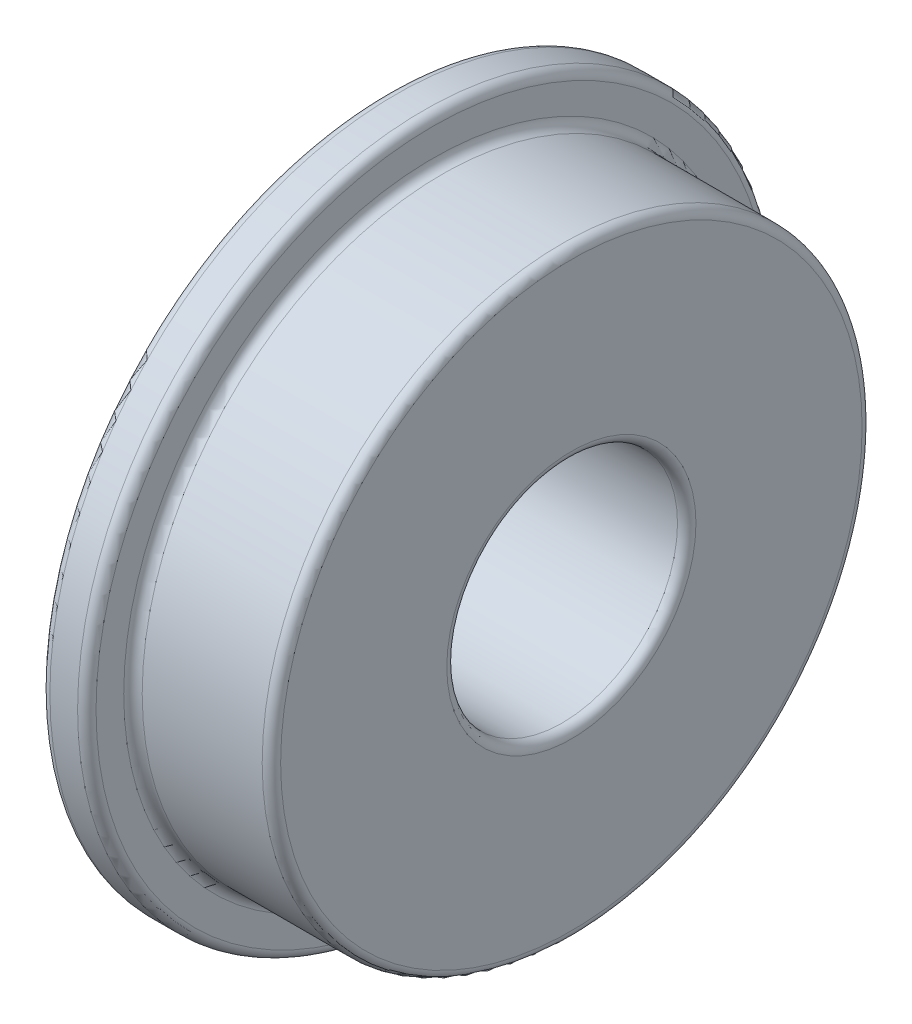
ISO-10303-21;
HEADER;
FILE_DESCRIPTION(('STEP AP214'),'2;1');
FILE_NAME('part.step','',(''),(''),'','','');
FILE_SCHEMA(('AUTOMOTIVE_DESIGN { 1 0 10303 214 1 1 1 1 }'));
ENDSEC;
DATA;
#1=APPLICATION_CONTEXT('core data for automotive mechanical design processes');
#2=APPLICATION_PROTOCOL_DEFINITION('international standard','automotive_design',2000,#1);
#3=PRODUCT_CONTEXT('',#1,'mechanical');
#4=PRODUCT('Part','Part','',(#3));
#5=PRODUCT_RELATED_PRODUCT_CATEGORY('part','',(#4));
#6=PRODUCT_DEFINITION_FORMATION('','',#4);
#7=PRODUCT_DEFINITION_CONTEXT('part definition',#1,'design');
#8=PRODUCT_DEFINITION('design','',#6,#7);
#9=PRODUCT_DEFINITION_SHAPE('','',#8);
#10=(LENGTH_UNIT() NAMED_UNIT(*) SI_UNIT(.MILLI.,.METRE.));
#11=(NAMED_UNIT(*) PLANE_ANGLE_UNIT() SI_UNIT($,.RADIAN.));
#12=(NAMED_UNIT(*) SI_UNIT($,.STERADIAN.) SOLID_ANGLE_UNIT());
#13=UNCERTAINTY_MEASURE_WITH_UNIT(LENGTH_MEASURE(1.E-05),#10,'distance_accuracy_value','');
#14=(GEOMETRIC_REPRESENTATION_CONTEXT(3) GLOBAL_UNCERTAINTY_ASSIGNED_CONTEXT((#13)) GLOBAL_UNIT_ASSIGNED_CONTEXT((#10,
#11,#12)) REPRESENTATION_CONTEXT('',''));
#15=CARTESIAN_POINT('',(0.,0.,0.));
#16=DIRECTION('',(0.,0.,1.));
#17=DIRECTION('',(1.,0.,0.));
#18=AXIS2_PLACEMENT_3D('',#15,#16,#17);
#19=CARTESIAN_POINT('',(0.,7.5,0.));
#20=DIRECTION('',(1.,0.,0.));
#21=DIRECTION('',(0.,0.,-1.));
#22=AXIS2_PLACEMENT_3D('',#19,#20,#21);
#23=PLANE('',#22);
#24=CARTESIAN_POINT('',(0.,0.,0.));
#25=DIRECTION('',(1.,0.,0.));
#26=DIRECTION('',(0.,0.,-1.));
#27=AXIS2_PLACEMENT_3D('',#24,#25,#26);
#28=CIRCLE('',#27,7.3);
#29=CARTESIAN_POINT('',(0.,0.,-7.3));
#30=VERTEX_POINT('',#29);
#31=EDGE_CURVE('E71',#30,#30,#28,.F.);
#32=ORIENTED_EDGE('',*,*,#31,.T.);
#33=EDGE_LOOP('',(#32));
#34=FACE_BOUND('',#33,.T.);
#35=CARTESIAN_POINT('',(0.,0.,0.));
#36=DIRECTION('',(1.,0.,0.));
#37=DIRECTION('',(0.,0.,-1.));
#38=AXIS2_PLACEMENT_3D('',#35,#36,#37);
#39=CIRCLE('',#38,2.7);
#40=CARTESIAN_POINT('',(0.,0.,-2.7));
#41=VERTEX_POINT('',#40);
#42=EDGE_CURVE('E74',#41,#41,#39,.T.);
#43=ORIENTED_EDGE('',*,*,#42,.T.);
#44=EDGE_LOOP('',(#43));
#45=FACE_BOUND('',#44,.T.);
#46=ADVANCED_FACE('F33',(#34,#45),#23,.F.);
#47=CARTESIAN_POINT('',(0.,0.,0.));
#48=DIRECTION('',(-1.,0.,0.));
#49=DIRECTION('',(0.,0.,1.));
#50=AXIS2_PLACEMENT_3D('',#47,#48,#49);
#51=CYLINDRICAL_SURFACE('',#50,2.5);
#52=CARTESIAN_POINT('',(0.200000000000001,0.,0.));
#53=DIRECTION('',(1.,0.,0.));
#54=DIRECTION('',(0.,0.,-1.));
#55=AXIS2_PLACEMENT_3D('',#52,#53,#54);
#56=CIRCLE('',#55,2.5);
#57=CARTESIAN_POINT('',(0.200000000000001,0.,-2.5));
#58=VERTEX_POINT('',#57);
#59=EDGE_CURVE('E59',#58,#58,#56,.F.);
#60=ORIENTED_EDGE('',*,*,#59,.T.);
#61=EDGE_LOOP('',(#60));
#62=FACE_BOUND('',#61,.T.);
#63=CARTESIAN_POINT('',(3.8,0.,0.));
#64=DIRECTION('',(-1.,0.,0.));
#65=DIRECTION('',(0.,0.,1.));
#66=AXIS2_PLACEMENT_3D('',#63,#64,#65);
#67=CIRCLE('',#66,2.5);
#68=CARTESIAN_POINT('',(3.8,0.,2.5));
#69=VERTEX_POINT('',#68);
#70=EDGE_CURVE('E62',#69,#69,#67,.F.);
#71=ORIENTED_EDGE('',*,*,#70,.T.);
#72=EDGE_LOOP('',(#71));
#73=FACE_BOUND('',#72,.T.);
#74=ADVANCED_FACE('F87',(#62,#73),#51,.F.);
#75=CARTESIAN_POINT('',(4.,2.5,0.));
#76=DIRECTION('',(-1.,0.,0.));
#77=DIRECTION('',(0.,0.,1.));
#78=AXIS2_PLACEMENT_3D('',#75,#76,#77);
#79=PLANE('',#78);
#80=CARTESIAN_POINT('',(4.,0.,0.));
#81=DIRECTION('',(-1.,0.,0.));
#82=DIRECTION('',(0.,0.,1.));
#83=AXIS2_PLACEMENT_3D('',#80,#81,#82);
#84=CIRCLE('',#83,2.7);
#85=CARTESIAN_POINT('',(4.,0.,2.7));
#86=VERTEX_POINT('',#85);
#87=EDGE_CURVE('E53',#86,#86,#84,.T.);
#88=ORIENTED_EDGE('',*,*,#87,.T.);
#89=EDGE_LOOP('',(#88));
#90=FACE_BOUND('',#89,.T.);
#91=CARTESIAN_POINT('',(4.,0.,0.));
#92=DIRECTION('',(-1.,0.,0.));
#93=DIRECTION('',(0.,0.,1.));
#94=AXIS2_PLACEMENT_3D('',#91,#92,#93);
#95=CIRCLE('',#94,6.3);
#96=CARTESIAN_POINT('',(4.,0.,6.3));
#97=VERTEX_POINT('',#96);
#98=EDGE_CURVE('E56',#97,#97,#95,.F.);
#99=ORIENTED_EDGE('',*,*,#98,.T.);
#100=EDGE_LOOP('',(#99));
#101=FACE_BOUND('',#100,.T.);
#102=ADVANCED_FACE('F90',(#90,#101),#79,.F.);
#103=CARTESIAN_POINT('',(0.,0.,0.));
#104=DIRECTION('',(-1.,0.,0.));
#105=DIRECTION('',(0.,0.,1.));
#106=AXIS2_PLACEMENT_3D('',#103,#104,#105);
#107=CYLINDRICAL_SURFACE('',#106,6.5);
#108=CARTESIAN_POINT('',(1.2,0.,0.));
#109=DIRECTION('',(-1.,0.,0.));
#110=DIRECTION('',(0.,0.,1.));
#111=AXIS2_PLACEMENT_3D('',#108,#109,#110);
#112=CIRCLE('',#111,6.5);
#113=CARTESIAN_POINT('',(1.2,0.,6.5));
#114=VERTEX_POINT('',#113);
#115=EDGE_CURVE('E10',#114,#114,#112,.F.);
#116=ORIENTED_EDGE('',*,*,#115,.T.);
#117=EDGE_LOOP('',(#116));
#118=FACE_BOUND('',#117,.T.);
#119=CARTESIAN_POINT('',(3.8,0.,0.));
#120=DIRECTION('',(-1.,0.,0.));
#121=DIRECTION('',(0.,0.,1.));
#122=AXIS2_PLACEMENT_3D('',#119,#120,#121);
#123=CIRCLE('',#122,6.5);
#124=CARTESIAN_POINT('',(3.8,0.,6.5));
#125=VERTEX_POINT('',#124);
#126=EDGE_CURVE('E40',#125,#125,#123,.T.);
#127=ORIENTED_EDGE('',*,*,#126,.T.);
#128=EDGE_LOOP('',(#127));
#129=FACE_BOUND('',#128,.T.);
#130=ADVANCED_FACE('F102',(#118,#129),#107,.T.);
#131=CARTESIAN_POINT('',(1.,6.5,0.));
#132=DIRECTION('',(-1.,0.,0.));
#133=DIRECTION('',(0.,0.,1.));
#134=AXIS2_PLACEMENT_3D('',#131,#132,#133);
#135=PLANE('',#134);
#136=CARTESIAN_POINT('',(1.,0.,0.));
#137=DIRECTION('',(-1.,0.,0.));
#138=DIRECTION('',(0.,0.,1.));
#139=AXIS2_PLACEMENT_3D('',#136,#137,#138);
#140=CIRCLE('',#139,6.7);
#141=CARTESIAN_POINT('',(1.,0.,6.7));
#142=VERTEX_POINT('',#141);
#143=EDGE_CURVE('E44',#142,#142,#140,.T.);
#144=ORIENTED_EDGE('',*,*,#143,.T.);
#145=EDGE_LOOP('',(#144));
#146=FACE_BOUND('',#145,.T.);
#147=CARTESIAN_POINT('',(1.,0.,0.));
#148=DIRECTION('',(-1.,0.,0.));
#149=DIRECTION('',(0.,0.,1.));
#150=AXIS2_PLACEMENT_3D('',#147,#148,#149);
#151=CIRCLE('',#150,7.3);
#152=CARTESIAN_POINT('',(1.,0.,7.3));
#153=VERTEX_POINT('',#152);
#154=EDGE_CURVE('E48',#153,#153,#151,.F.);
#155=ORIENTED_EDGE('',*,*,#154,.T.);
#156=EDGE_LOOP('',(#155));
#157=FACE_BOUND('',#156,.T.);
#158=ADVANCED_FACE('F129',(#146,#157),#135,.F.);
#159=CARTESIAN_POINT('',(0.,0.,0.));
#160=DIRECTION('',(-1.,0.,0.));
#161=DIRECTION('',(0.,0.,1.));
#162=AXIS2_PLACEMENT_3D('',#159,#160,#161);
#163=CYLINDRICAL_SURFACE('',#162,7.5);
#164=CARTESIAN_POINT('',(0.200000000000001,0.,0.));
#165=DIRECTION('',(1.,0.,0.));
#166=DIRECTION('',(0.,0.,-1.));
#167=AXIS2_PLACEMENT_3D('',#164,#165,#166);
#168=CIRCLE('',#167,7.5);
#169=CARTESIAN_POINT('',(0.200000000000001,0.,-7.5));
#170=VERTEX_POINT('',#169);
#171=EDGE_CURVE('E65',#170,#170,#168,.T.);
#172=ORIENTED_EDGE('',*,*,#171,.T.);
#173=EDGE_LOOP('',(#172));
#174=FACE_BOUND('',#173,.T.);
#175=CARTESIAN_POINT('',(0.8,0.,0.));
#176=DIRECTION('',(-1.,0.,0.));
#177=DIRECTION('',(0.,0.,1.));
#178=AXIS2_PLACEMENT_3D('',#175,#176,#177);
#179=CIRCLE('',#178,7.5);
#180=CARTESIAN_POINT('',(0.8,0.,7.5));
#181=VERTEX_POINT('',#180);
#182=EDGE_CURVE('E68',#181,#181,#179,.T.);
#183=ORIENTED_EDGE('',*,*,#182,.T.);
#184=EDGE_LOOP('',(#183));
#185=FACE_BOUND('',#184,.T.);
#186=ADVANCED_FACE('F123',(#174,#185),#163,.T.);
#187=CARTESIAN_POINT('',(0.200000000000001,0.,0.));
#188=DIRECTION('',(1.,0.,0.));
#189=DIRECTION('',(0.,0.,-1.));
#190=AXIS2_PLACEMENT_3D('',#187,#188,#189);
#191=TOROIDAL_SURFACE('',#190,7.3,0.2);
#192=ORIENTED_EDGE('',*,*,#171,.F.);
#193=EDGE_LOOP('',(#192));
#194=FACE_BOUND('',#193,.T.);
#195=ORIENTED_EDGE('',*,*,#31,.F.);
#196=EDGE_LOOP('',(#195));
#197=FACE_BOUND('',#196,.T.);
#198=ADVANCED_FACE('F83',(#194,#197),#191,.T.);
#199=CARTESIAN_POINT('',(0.200000000000001,0.,0.));
#200=DIRECTION('',(1.,0.,0.));
#201=DIRECTION('',(0.,0.,-1.));
#202=AXIS2_PLACEMENT_3D('',#199,#200,#201);
#203=TOROIDAL_SURFACE('',#202,2.7,0.2);
#204=ORIENTED_EDGE('',*,*,#42,.F.);
#205=EDGE_LOOP('',(#204));
#206=FACE_BOUND('',#205,.T.);
#207=ORIENTED_EDGE('',*,*,#59,.F.);
#208=EDGE_LOOP('',(#207));
#209=FACE_BOUND('',#208,.T.);
#210=ADVANCED_FACE('F79',(#206,#209),#203,.T.);
#211=CARTESIAN_POINT('',(3.8,0.,0.));
#212=DIRECTION('',(-1.,0.,0.));
#213=DIRECTION('',(0.,0.,1.));
#214=AXIS2_PLACEMENT_3D('',#211,#212,#213);
#215=TOROIDAL_SURFACE('',#214,2.7,0.2);
#216=ORIENTED_EDGE('',*,*,#70,.F.);
#217=EDGE_LOOP('',(#216));
#218=FACE_BOUND('',#217,.T.);
#219=ORIENTED_EDGE('',*,*,#87,.F.);
#220=EDGE_LOOP('',(#219));
#221=FACE_BOUND('',#220,.T.);
#222=ADVANCED_FACE('F82',(#218,#221),#215,.T.);
#223=CARTESIAN_POINT('',(1.2,0.,0.));
#224=DIRECTION('',(-1.,0.,0.));
#225=DIRECTION('',(0.,0.,1.));
#226=AXIS2_PLACEMENT_3D('',#223,#224,#225);
#227=TOROIDAL_SURFACE('',#226,6.7,0.2);
#228=ORIENTED_EDGE('',*,*,#115,.F.);
#229=EDGE_LOOP('',(#228));
#230=FACE_BOUND('',#229,.T.);
#231=ORIENTED_EDGE('',*,*,#143,.F.);
#232=EDGE_LOOP('',(#231));
#233=FACE_BOUND('',#232,.T.);
#234=ADVANCED_FACE('F96',(#230,#233),#227,.F.);
#235=CARTESIAN_POINT('',(3.8,0.,0.));
#236=DIRECTION('',(-1.,0.,0.));
#237=DIRECTION('',(0.,0.,1.));
#238=AXIS2_PLACEMENT_3D('',#235,#236,#237);
#239=TOROIDAL_SURFACE('',#238,6.3,0.2);
#240=ORIENTED_EDGE('',*,*,#98,.F.);
#241=EDGE_LOOP('',(#240));
#242=FACE_BOUND('',#241,.T.);
#243=ORIENTED_EDGE('',*,*,#126,.F.);
#244=EDGE_LOOP('',(#243));
#245=FACE_BOUND('',#244,.T.);
#246=ADVANCED_FACE('F106',(#242,#245),#239,.T.);
#247=CARTESIAN_POINT('',(0.8,0.,0.));
#248=DIRECTION('',(-1.,0.,0.));
#249=DIRECTION('',(0.,0.,1.));
#250=AXIS2_PLACEMENT_3D('',#247,#248,#249);
#251=TOROIDAL_SURFACE('',#250,7.3,0.2);
#252=ORIENTED_EDGE('',*,*,#154,.F.);
#253=EDGE_LOOP('',(#252));
#254=FACE_BOUND('',#253,.T.);
#255=ORIENTED_EDGE('',*,*,#182,.F.);
#256=EDGE_LOOP('',(#255));
#257=FACE_BOUND('',#256,.T.);
#258=ADVANCED_FACE('F35',(#254,#257),#251,.T.);
#259=CLOSED_SHELL('',(#46,#74,#102,#130,#158,#186,#198,#210,#222,#234,#246,#258));
#260=MANIFOLD_SOLID_BREP('B2',#259);
#261=ADVANCED_BREP_SHAPE_REPRESENTATION('',(#18,#260),#14);
#262=SHAPE_DEFINITION_REPRESENTATION(#9,#261);
ENDSEC;
END-ISO-10303-21;
